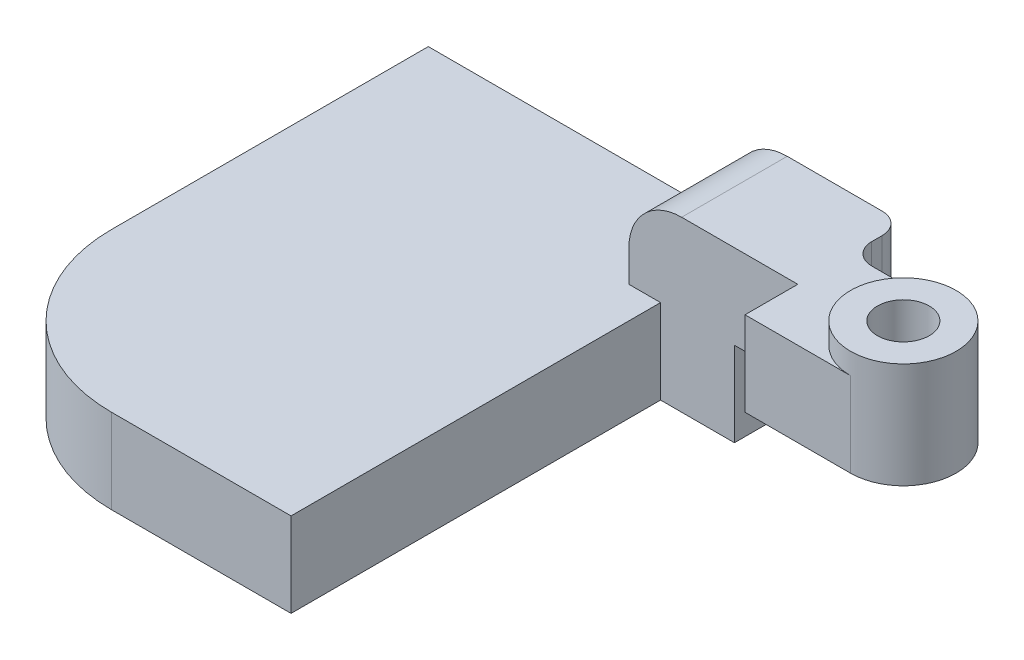
ISO-10303-21;
HEADER;
FILE_DESCRIPTION(('STEP AP214'),'2;1');
FILE_NAME('part.step','',(''),(''),'','','');
FILE_SCHEMA(('AUTOMOTIVE_DESIGN { 1 0 10303 214 1 1 1 1 }'));
ENDSEC;
DATA;
#1=APPLICATION_CONTEXT('core data for automotive mechanical design processes');
#2=APPLICATION_PROTOCOL_DEFINITION('international standard','automotive_design',2000,#1);
#3=PRODUCT_CONTEXT('',#1,'mechanical');
#4=PRODUCT('Part','Part','',(#3));
#5=PRODUCT_RELATED_PRODUCT_CATEGORY('part','',(#4));
#6=PRODUCT_DEFINITION_FORMATION('','',#4);
#7=PRODUCT_DEFINITION_CONTEXT('part definition',#1,'design');
#8=PRODUCT_DEFINITION('design','',#6,#7);
#9=PRODUCT_DEFINITION_SHAPE('','',#8);
#10=(LENGTH_UNIT() NAMED_UNIT(*) SI_UNIT(.MILLI.,.METRE.));
#11=(NAMED_UNIT(*) PLANE_ANGLE_UNIT() SI_UNIT($,.RADIAN.));
#12=(NAMED_UNIT(*) SI_UNIT($,.STERADIAN.) SOLID_ANGLE_UNIT());
#13=UNCERTAINTY_MEASURE_WITH_UNIT(LENGTH_MEASURE(1.E-05),#10,'distance_accuracy_value','');
#14=(GEOMETRIC_REPRESENTATION_CONTEXT(3) GLOBAL_UNCERTAINTY_ASSIGNED_CONTEXT((#13)) GLOBAL_UNIT_ASSIGNED_CONTEXT((#10,
#11,#12)) REPRESENTATION_CONTEXT('',''));
#15=CARTESIAN_POINT('',(0.,0.,0.));
#16=DIRECTION('',(0.,0.,1.));
#17=DIRECTION('',(1.,0.,0.));
#18=AXIS2_PLACEMENT_3D('',#15,#16,#17);
#19=CARTESIAN_POINT('',(0.,0.,0.));
#20=DIRECTION('',(0.,1.,0.));
#21=DIRECTION('',(0.,0.,1.));
#22=AXIS2_PLACEMENT_3D('',#19,#20,#21);
#23=PLANE('',#22);
#24=DIRECTION('',(0.,0.,1.));
#25=VECTOR('',#24,1.);
#26=CARTESIAN_POINT('',(-28.,0.,30.));
#27=LINE('',#26,#25);
#28=CARTESIAN_POINT('',(-28.,0.,-5.));
#29=VERTEX_POINT('',#28);
#30=CARTESIAN_POINT('',(-28.,0.,30.));
#31=VERTEX_POINT('',#30);
#32=EDGE_CURVE('E315',#29,#31,#27,.T.);
#33=ORIENTED_EDGE('',*,*,#32,.F.);
#34=DIRECTION('',(1.,0.,0.));
#35=VECTOR('',#34,1.);
#36=CARTESIAN_POINT('',(-31.,0.,-5.));
#37=LINE('',#36,#35);
#38=CARTESIAN_POINT('',(-31.,0.,-5.));
#39=VERTEX_POINT('',#38);
#40=EDGE_CURVE('E193',#39,#29,#37,.T.);
#41=ORIENTED_EDGE('',*,*,#40,.F.);
#42=DIRECTION('',(0.,0.,1.));
#43=VECTOR('',#42,1.);
#44=CARTESIAN_POINT('',(-31.,0.,-5.));
#45=LINE('',#44,#43);
#46=CARTESIAN_POINT('',(-31.,0.,-15.));
#47=VERTEX_POINT('',#46);
#48=EDGE_CURVE('E179',#47,#39,#45,.T.);
#49=ORIENTED_EDGE('',*,*,#48,.F.);
#50=DIRECTION('',(-1.,0.,0.));
#51=VECTOR('',#50,1.);
#52=CARTESIAN_POINT('',(-25.,0.,-15.));
#53=LINE('',#52,#51);
#54=CARTESIAN_POINT('',(-60.,0.,-15.));
#55=VERTEX_POINT('',#54);
#56=EDGE_CURVE('E191',#47,#55,#53,.T.);
#57=ORIENTED_EDGE('',*,*,#56,.T.);
#58=DIRECTION('',(0.,0.,-1.));
#59=VECTOR('',#58,1.);
#60=CARTESIAN_POINT('',(-60.,0.,30.));
#61=LINE('',#60,#59);
#62=CARTESIAN_POINT('',(-60.,0.,15.));
#63=VERTEX_POINT('',#62);
#64=EDGE_CURVE('E283',#63,#55,#61,.T.);
#65=ORIENTED_EDGE('',*,*,#64,.F.);
#66=CARTESIAN_POINT('',(-45.,0.,15.));
#67=DIRECTION('',(0.,1.,0.));
#68=DIRECTION('',(0.,0.,1.));
#69=AXIS2_PLACEMENT_3D('',#66,#67,#68);
#70=CIRCLE('',#69,15.);
#71=CARTESIAN_POINT('',(-45.,0.,30.));
#72=VERTEX_POINT('',#71);
#73=EDGE_CURVE('E241',#63,#72,#70,.T.);
#74=ORIENTED_EDGE('',*,*,#73,.T.);
#75=DIRECTION('',(1.,0.,0.));
#76=VECTOR('',#75,1.);
#77=CARTESIAN_POINT('',(-25.,0.,30.));
#78=LINE('',#77,#76);
#79=EDGE_CURVE('E201',#72,#31,#78,.T.);
#80=ORIENTED_EDGE('',*,*,#79,.T.);
#81=EDGE_LOOP('',(#33,#41,#49,#57,#65,#74,#80));
#82=FACE_BOUND('',#81,.T.);
#83=ADVANCED_FACE('F45',(#82),#23,.T.);
#84=CARTESIAN_POINT('',(-70.,0.,30.));
#85=DIRECTION('',(0.,0.,-1.));
#86=DIRECTION('',(-1.,0.,0.));
#87=AXIS2_PLACEMENT_3D('',#84,#85,#86);
#88=PLANE('',#87);
#89=ORIENTED_EDGE('',*,*,#79,.F.);
#90=DIRECTION('',(0.,1.,0.));
#91=VECTOR('',#90,1.);
#92=CARTESIAN_POINT('',(-45.,0.,30.));
#93=LINE('',#92,#91);
#94=CARTESIAN_POINT('',(-45.,-8.,30.));
#95=VERTEX_POINT('',#94);
#96=EDGE_CURVE('E244',#72,#95,#93,.F.);
#97=ORIENTED_EDGE('',*,*,#96,.T.);
#98=DIRECTION('',(-1.,0.,0.));
#99=VECTOR('',#98,1.);
#100=CARTESIAN_POINT('',(-70.,-8.,30.));
#101=LINE('',#100,#99);
#102=CARTESIAN_POINT('',(-28.,-8.,30.));
#103=VERTEX_POINT('',#102);
#104=EDGE_CURVE('E333',#103,#95,#101,.T.);
#105=ORIENTED_EDGE('',*,*,#104,.F.);
#106=DIRECTION('',(0.,-1.,0.));
#107=VECTOR('',#106,1.);
#108=CARTESIAN_POINT('',(-28.,0.,30.));
#109=LINE('',#108,#107);
#110=EDGE_CURVE('E258',#31,#103,#109,.T.);
#111=ORIENTED_EDGE('',*,*,#110,.F.);
#112=EDGE_LOOP('',(#89,#97,#105,#111));
#113=FACE_BOUND('',#112,.T.);
#114=ADVANCED_FACE('F403',(#113),#88,.F.);
#115=CARTESIAN_POINT('',(-70.,0.,-15.));
#116=DIRECTION('',(0.,0.,-1.));
#117=DIRECTION('',(-1.,0.,0.));
#118=AXIS2_PLACEMENT_3D('',#115,#116,#117);
#119=PLANE('',#118);
#120=DIRECTION('',(0.,-1.,0.));
#121=VECTOR('',#120,1.);
#122=CARTESIAN_POINT('',(-31.,8.,-15.));
#123=LINE('',#122,#121);
#124=CARTESIAN_POINT('',(-31.,3.,-15.));
#125=VERTEX_POINT('',#124);
#126=EDGE_CURVE('E175',#125,#47,#123,.T.);
#127=ORIENTED_EDGE('',*,*,#126,.F.);
#128=CARTESIAN_POINT('',(-26.,3.,-15.));
#129=DIRECTION('',(0.,0.,-1.));
#130=DIRECTION('',(-1.,0.,0.));
#131=AXIS2_PLACEMENT_3D('',#128,#129,#130);
#132=CIRCLE('',#131,5.);
#133=CARTESIAN_POINT('',(-26.,8.,-15.));
#134=VERTEX_POINT('',#133);
#135=EDGE_CURVE('E68',#125,#134,#132,.T.);
#136=ORIENTED_EDGE('',*,*,#135,.T.);
#137=DIRECTION('',(-1.,0.,0.));
#138=VECTOR('',#137,1.);
#139=CARTESIAN_POINT('',(-70.,8.,-15.));
#140=LINE('',#139,#138);
#141=CARTESIAN_POINT('',(-17.,8.,-15.));
#142=VERTEX_POINT('',#141);
#143=EDGE_CURVE('E312',#142,#134,#140,.T.);
#144=ORIENTED_EDGE('',*,*,#143,.F.);
#145=DIRECTION('',(0.,-1.,0.));
#146=VECTOR('',#145,1.);
#147=CARTESIAN_POINT('',(-17.,0.,-15.));
#148=LINE('',#147,#146);
#149=CARTESIAN_POINT('',(-17.,0.,-15.));
#150=VERTEX_POINT('',#149);
#151=EDGE_CURVE('E206',#142,#150,#148,.T.);
#152=ORIENTED_EDGE('',*,*,#151,.T.);
#153=DIRECTION('',(1.,0.,0.));
#154=VECTOR('',#153,1.);
#155=CARTESIAN_POINT('',(-21.,0.,-15.));
#156=LINE('',#155,#154);
#157=CARTESIAN_POINT('',(-21.,0.,-15.));
#158=VERTEX_POINT('',#157);
#159=EDGE_CURVE('E447',#158,#150,#156,.T.);
#160=ORIENTED_EDGE('',*,*,#159,.F.);
#161=DIRECTION('',(0.,-1.,0.));
#162=VECTOR('',#161,1.);
#163=CARTESIAN_POINT('',(-21.,-3.,-15.));
#164=LINE('',#163,#162);
#165=CARTESIAN_POINT('',(-21.,-8.,-15.));
#166=VERTEX_POINT('',#165);
#167=EDGE_CURVE('E307',#158,#166,#164,.T.);
#168=ORIENTED_EDGE('',*,*,#167,.T.);
#169=DIRECTION('',(1.,0.,0.));
#170=VECTOR('',#169,1.);
#171=CARTESIAN_POINT('',(-70.,-8.,-15.));
#172=LINE('',#171,#170);
#173=CARTESIAN_POINT('',(-60.,-8.,-15.));
#174=VERTEX_POINT('',#173);
#175=EDGE_CURVE('E329',#174,#166,#172,.T.);
#176=ORIENTED_EDGE('',*,*,#175,.F.);
#177=DIRECTION('',(0.,-1.,0.));
#178=VECTOR('',#177,1.);
#179=CARTESIAN_POINT('',(-60.,0.,-15.));
#180=LINE('',#179,#178);
#181=EDGE_CURVE('E199',#55,#174,#180,.T.);
#182=ORIENTED_EDGE('',*,*,#181,.F.);
#183=ORIENTED_EDGE('',*,*,#56,.F.);
#184=EDGE_LOOP('',(#127,#136,#144,#152,#160,#168,#176,#182,#183));
#185=FACE_BOUND('',#184,.T.);
#186=ADVANCED_FACE('F197',(#185),#119,.T.);
#187=CARTESIAN_POINT('',(-25.,-2.,-5.));
#188=DIRECTION('',(0.,0.,1.));
#189=DIRECTION('',(1.,0.,0.));
#190=AXIS2_PLACEMENT_3D('',#187,#188,#189);
#191=PLANE('',#190);
#192=DIRECTION('',(1.,0.,0.));
#193=VECTOR('',#192,1.);
#194=CARTESIAN_POINT('',(-25.,8.,-5.));
#195=LINE('',#194,#193);
#196=CARTESIAN_POINT('',(-26.,8.,-5.));
#197=VERTEX_POINT('',#196);
#198=CARTESIAN_POINT('',(-15.,8.,-5.));
#199=VERTEX_POINT('',#198);
#200=EDGE_CURVE('E301',#197,#199,#195,.T.);
#201=ORIENTED_EDGE('',*,*,#200,.F.);
#202=CARTESIAN_POINT('',(-26.,3.,-5.));
#203=DIRECTION('',(0.,0.,1.));
#204=DIRECTION('',(1.,0.,0.));
#205=AXIS2_PLACEMENT_3D('',#202,#203,#204);
#206=CIRCLE('',#205,5.);
#207=CARTESIAN_POINT('',(-31.,3.,-5.));
#208=VERTEX_POINT('',#207);
#209=EDGE_CURVE('E11',#197,#208,#206,.T.);
#210=ORIENTED_EDGE('',*,*,#209,.T.);
#211=DIRECTION('',(0.,1.,0.));
#212=VECTOR('',#211,1.);
#213=CARTESIAN_POINT('',(-31.,8.,-5.));
#214=LINE('',#213,#212);
#215=EDGE_CURVE('E185',#39,#208,#214,.T.);
#216=ORIENTED_EDGE('',*,*,#215,.F.);
#217=ORIENTED_EDGE('',*,*,#40,.T.);
#218=DIRECTION('',(0.,1.,0.));
#219=VECTOR('',#218,1.);
#220=CARTESIAN_POINT('',(-28.,0.,-5.));
#221=LINE('',#220,#219);
#222=CARTESIAN_POINT('',(-28.,-8.,-5.));
#223=VERTEX_POINT('',#222);
#224=EDGE_CURVE('E257',#223,#29,#221,.T.);
#225=ORIENTED_EDGE('',*,*,#224,.F.);
#226=DIRECTION('',(1.,0.,0.));
#227=VECTOR('',#226,1.);
#228=CARTESIAN_POINT('',(-25.,-8.,-5.));
#229=LINE('',#228,#227);
#230=CARTESIAN_POINT('',(-21.,-8.,-5.));
#231=VERTEX_POINT('',#230);
#232=EDGE_CURVE('E337',#223,#231,#229,.T.);
#233=ORIENTED_EDGE('',*,*,#232,.T.);
#234=DIRECTION('',(0.,-1.,0.));
#235=VECTOR('',#234,1.);
#236=CARTESIAN_POINT('',(-21.,-3.,-5.));
#237=LINE('',#236,#235);
#238=CARTESIAN_POINT('',(-21.,0.,-4.99999999999998));
#239=VERTEX_POINT('',#238);
#240=EDGE_CURVE('E464',#239,#231,#237,.T.);
#241=ORIENTED_EDGE('',*,*,#240,.F.);
#242=DIRECTION('',(-1.,0.,0.));
#243=VECTOR('',#242,1.);
#244=CARTESIAN_POINT('',(-25.,0.,-5.));
#245=LINE('',#244,#243);
#246=CARTESIAN_POINT('',(-15.,0.,-4.99999999999998));
#247=VERTEX_POINT('',#246);
#248=EDGE_CURVE('E276',#247,#239,#245,.T.);
#249=ORIENTED_EDGE('',*,*,#248,.F.);
#250=DIRECTION('',(0.,1.,0.));
#251=VECTOR('',#250,1.);
#252=CARTESIAN_POINT('',(-15.,-2.,-5.));
#253=LINE('',#252,#251);
#254=EDGE_CURVE('E270',#247,#199,#253,.T.);
#255=ORIENTED_EDGE('',*,*,#254,.T.);
#256=EDGE_LOOP('',(#201,#210,#216,#217,#225,#233,#241,#249,#255));
#257=FACE_BOUND('',#256,.T.);
#258=ADVANCED_FACE('F410',(#257),#191,.T.);
#259=CARTESIAN_POINT('',(-15.,0.,13.8679622641132));
#260=DIRECTION('',(1.,0.,0.));
#261=DIRECTION('',(0.,0.,-1.));
#262=AXIS2_PLACEMENT_3D('',#259,#260,#261);
#263=PLANE('',#262);
#264=DIRECTION('',(0.,0.,-1.));
#265=VECTOR('',#264,1.);
#266=CARTESIAN_POINT('',(-15.,0.,30.));
#267=LINE('',#266,#265);
#268=CARTESIAN_POINT('',(-15.,0.,-12.));
#269=VERTEX_POINT('',#268);
#270=CARTESIAN_POINT('',(-15.,0.,-13.));
#271=VERTEX_POINT('',#270);
#272=EDGE_CURVE('E456',#269,#271,#267,.T.);
#273=ORIENTED_EDGE('',*,*,#272,.T.);
#274=DIRECTION('',(0.,-1.,0.));
#275=VECTOR('',#274,1.);
#276=CARTESIAN_POINT('',(-15.,0.,-13.));
#277=LINE('',#276,#275);
#278=CARTESIAN_POINT('',(-15.,8.,-13.));
#279=VERTEX_POINT('',#278);
#280=EDGE_CURVE('E221',#271,#279,#277,.F.);
#281=ORIENTED_EDGE('',*,*,#280,.T.);
#282=DIRECTION('',(0.,0.,-1.));
#283=VECTOR('',#282,1.);
#284=CARTESIAN_POINT('',(-15.,8.,-9.99999999999999));
#285=LINE('',#284,#283);
#286=CARTESIAN_POINT('',(-15.,8.,-12.));
#287=VERTEX_POINT('',#286);
#288=EDGE_CURVE('E363',#287,#279,#285,.T.);
#289=ORIENTED_EDGE('',*,*,#288,.F.);
#290=DIRECTION('',(0.,1.,0.));
#291=VECTOR('',#290,1.);
#292=CARTESIAN_POINT('',(-15.,0.,-12.));
#293=LINE('',#292,#291);
#294=EDGE_CURVE('E217',#287,#269,#293,.F.);
#295=ORIENTED_EDGE('',*,*,#294,.T.);
#296=EDGE_LOOP('',(#273,#281,#289,#295));
#297=FACE_BOUND('',#296,.T.);
#298=ADVANCED_FACE('F501',(#297),#263,.T.);
#299=CARTESIAN_POINT('',(0.,0.,0.));
#300=DIRECTION('',(0.,1.,0.));
#301=DIRECTION('',(0.,0.,1.));
#302=AXIS2_PLACEMENT_3D('',#299,#300,#301);
#303=PLANE('',#302);
#304=CARTESIAN_POINT('',(-5.,0.,-5.));
#305=DIRECTION('',(0.,-1.,0.));
#306=DIRECTION('',(0.,0.,-1.));
#307=AXIS2_PLACEMENT_3D('',#304,#305,#306);
#308=CIRCLE('',#307,2.25000000000001);
#309=CARTESIAN_POINT('',(-5.,0.,-7.25000000000001));
#310=VERTEX_POINT('',#309);
#311=EDGE_CURVE('E202',#310,#310,#308,.T.);
#312=ORIENTED_EDGE('',*,*,#311,.F.);
#313=EDGE_LOOP('',(#312));
#314=FACE_BOUND('',#313,.T.);
#315=DIRECTION('',(0.,0.,-1.));
#316=VECTOR('',#315,1.);
#317=CARTESIAN_POINT('',(-15.,0.,0.));
#318=LINE('',#317,#316);
#319=CARTESIAN_POINT('',(-15.,0.,0.));
#320=VERTEX_POINT('',#319);
#321=EDGE_CURVE('E298',#320,#247,#318,.T.);
#322=ORIENTED_EDGE('',*,*,#321,.T.);
#323=ORIENTED_EDGE('',*,*,#248,.T.);
#324=DIRECTION('',(0.,0.,-1.));
#325=VECTOR('',#324,1.);
#326=CARTESIAN_POINT('',(-21.,0.,30.));
#327=LINE('',#326,#325);
#328=EDGE_CURVE('E450',#239,#158,#327,.T.);
#329=ORIENTED_EDGE('',*,*,#328,.T.);
#330=ORIENTED_EDGE('',*,*,#159,.T.);
#331=CARTESIAN_POINT('',(-17.,0.,-13.));
#332=DIRECTION('',(0.,1.,0.));
#333=DIRECTION('',(0.,0.,1.));
#334=AXIS2_PLACEMENT_3D('',#331,#332,#333);
#335=CIRCLE('',#334,2.);
#336=EDGE_CURVE('E280',#150,#271,#335,.F.);
#337=ORIENTED_EDGE('',*,*,#336,.T.);
#338=ORIENTED_EDGE('',*,*,#272,.F.);
#339=CARTESIAN_POINT('',(-13.,0.,-12.));
#340=DIRECTION('',(0.,1.,0.));
#341=DIRECTION('',(0.,0.,1.));
#342=AXIS2_PLACEMENT_3D('',#339,#340,#341);
#343=CIRCLE('',#342,2.);
#344=CARTESIAN_POINT('',(-13.,0.,-10.));
#345=VERTEX_POINT('',#344);
#346=EDGE_CURVE('E234',#269,#345,#343,.T.);
#347=ORIENTED_EDGE('',*,*,#346,.T.);
#348=DIRECTION('',(-1.,0.,0.));
#349=VECTOR('',#348,1.);
#350=CARTESIAN_POINT('',(0.,0.,-10.));
#351=LINE('',#350,#349);
#352=CARTESIAN_POINT('',(-5.,0.,-10.));
#353=VERTEX_POINT('',#352);
#354=EDGE_CURVE('E349',#353,#345,#351,.T.);
#355=ORIENTED_EDGE('',*,*,#354,.F.);
#356=CARTESIAN_POINT('',(-5.,0.,-5.));
#357=DIRECTION('',(0.,1.,0.));
#358=DIRECTION('',(0.,0.,1.));
#359=AXIS2_PLACEMENT_3D('',#356,#357,#358);
#360=CIRCLE('',#359,5.);
#361=CARTESIAN_POINT('',(0.,0.,-5.));
#362=VERTEX_POINT('',#361);
#363=EDGE_CURVE('E341',#353,#362,#360,.F.);
#364=ORIENTED_EDGE('',*,*,#363,.T.);
#365=CARTESIAN_POINT('',(-5.,0.,-5.));
#366=DIRECTION('',(0.,1.,0.));
#367=DIRECTION('',(0.,0.,1.));
#368=AXIS2_PLACEMENT_3D('',#365,#366,#367);
#369=CIRCLE('',#368,5.);
#370=CARTESIAN_POINT('',(-5.,0.,0.));
#371=VERTEX_POINT('',#370);
#372=EDGE_CURVE('E302',#362,#371,#369,.F.);
#373=ORIENTED_EDGE('',*,*,#372,.T.);
#374=DIRECTION('',(1.,0.,0.));
#375=VECTOR('',#374,1.);
#376=CARTESIAN_POINT('',(-25.,0.,0.));
#377=LINE('',#376,#375);
#378=EDGE_CURVE('E309',#320,#371,#377,.T.);
#379=ORIENTED_EDGE('',*,*,#378,.F.);
#380=EDGE_LOOP('',(#322,#323,#329,#330,#337,#338,#347,#355,#364,#373,#379));
#381=FACE_BOUND('',#380,.T.);
#382=ADVANCED_FACE('F472',(#314,#381),#303,.F.);
#383=CARTESIAN_POINT('',(0.,8.,0.));
#384=DIRECTION('',(0.,1.,0.));
#385=DIRECTION('',(0.,0.,1.));
#386=AXIS2_PLACEMENT_3D('',#383,#384,#385);
#387=PLANE('',#386);
#388=ORIENTED_EDGE('',*,*,#143,.T.);
#389=DIRECTION('',(0.,0.,-1.));
#390=VECTOR('',#389,1.);
#391=CARTESIAN_POINT('',(-26.,8.,-5.));
#392=LINE('',#391,#390);
#393=EDGE_CURVE('E54',#134,#197,#392,.F.);
#394=ORIENTED_EDGE('',*,*,#393,.T.);
#395=ORIENTED_EDGE('',*,*,#200,.T.);
#396=DIRECTION('',(0.,0.,-1.));
#397=VECTOR('',#396,1.);
#398=CARTESIAN_POINT('',(-15.,8.,0.));
#399=LINE('',#398,#397);
#400=CARTESIAN_POINT('',(-15.,8.,0.));
#401=VERTEX_POINT('',#400);
#402=EDGE_CURVE('E269',#401,#199,#399,.T.);
#403=ORIENTED_EDGE('',*,*,#402,.F.);
#404=DIRECTION('',(1.,0.,0.));
#405=VECTOR('',#404,1.);
#406=CARTESIAN_POINT('',(-25.,8.,0.));
#407=LINE('',#406,#405);
#408=CARTESIAN_POINT('',(-5.,8.,0.));
#409=VERTEX_POINT('',#408);
#410=EDGE_CURVE('E364',#401,#409,#407,.T.);
#411=ORIENTED_EDGE('',*,*,#410,.T.);
#412=CARTESIAN_POINT('',(-5.,8.,-5.));
#413=DIRECTION('',(0.,1.,0.));
#414=DIRECTION('',(0.,0.,1.));
#415=AXIS2_PLACEMENT_3D('',#412,#413,#414);
#416=CIRCLE('',#415,5.);
#417=CARTESIAN_POINT('',(-5.,8.,-10.));
#418=VERTEX_POINT('',#417);
#419=EDGE_CURVE('E292',#418,#409,#416,.T.);
#420=ORIENTED_EDGE('',*,*,#419,.F.);
#421=DIRECTION('',(-1.,0.,0.));
#422=VECTOR('',#421,1.);
#423=CARTESIAN_POINT('',(0.,8.,-10.));
#424=LINE('',#423,#422);
#425=CARTESIAN_POINT('',(-13.,8.,-10.));
#426=VERTEX_POINT('',#425);
#427=EDGE_CURVE('E359',#418,#426,#424,.T.);
#428=ORIENTED_EDGE('',*,*,#427,.T.);
#429=CARTESIAN_POINT('',(-13.,8.,-12.));
#430=DIRECTION('',(0.,1.,0.));
#431=DIRECTION('',(0.,0.,1.));
#432=AXIS2_PLACEMENT_3D('',#429,#430,#431);
#433=CIRCLE('',#432,2.);
#434=EDGE_CURVE('E231',#426,#287,#433,.F.);
#435=ORIENTED_EDGE('',*,*,#434,.T.);
#436=ORIENTED_EDGE('',*,*,#288,.T.);
#437=CARTESIAN_POINT('',(-17.,8.,-13.));
#438=DIRECTION('',(0.,1.,0.));
#439=DIRECTION('',(0.,0.,1.));
#440=AXIS2_PLACEMENT_3D('',#437,#438,#439);
#441=CIRCLE('',#440,2.);
#442=EDGE_CURVE('E224',#279,#142,#441,.T.);
#443=ORIENTED_EDGE('',*,*,#442,.T.);
#444=EDGE_LOOP('',(#388,#394,#395,#403,#411,#420,#428,#435,#436,#443));
#445=FACE_BOUND('',#444,.T.);
#446=ADVANCED_FACE('F481',(#445),#387,.T.);
#447=CARTESIAN_POINT('',(-25.,8.,0.));
#448=DIRECTION('',(0.,0.,-1.));
#449=DIRECTION('',(-1.,0.,0.));
#450=AXIS2_PLACEMENT_3D('',#447,#448,#449);
#451=PLANE('',#450);
#452=ORIENTED_EDGE('',*,*,#410,.F.);
#453=DIRECTION('',(0.,1.,0.));
#454=VECTOR('',#453,1.);
#455=CARTESIAN_POINT('',(-15.,-2.,0.));
#456=LINE('',#455,#454);
#457=EDGE_CURVE('E267',#320,#401,#456,.T.);
#458=ORIENTED_EDGE('',*,*,#457,.F.);
#459=ORIENTED_EDGE('',*,*,#378,.T.);
#460=DIRECTION('',(0.,-1.,0.));
#461=VECTOR('',#460,1.);
#462=CARTESIAN_POINT('',(-5.,8.,0.));
#463=LINE('',#462,#461);
#464=EDGE_CURVE('E311',#371,#409,#463,.F.);
#465=ORIENTED_EDGE('',*,*,#464,.T.);
#466=EDGE_LOOP('',(#452,#458,#459,#465));
#467=FACE_BOUND('',#466,.T.);
#468=ADVANCED_FACE('F483',(#467),#451,.F.);
#469=CARTESIAN_POINT('',(0.,8.,-10.));
#470=DIRECTION('',(0.,0.,1.));
#471=DIRECTION('',(1.,0.,0.));
#472=AXIS2_PLACEMENT_3D('',#469,#470,#471);
#473=PLANE('',#472);
#474=ORIENTED_EDGE('',*,*,#354,.T.);
#475=DIRECTION('',(0.,1.,0.));
#476=VECTOR('',#475,1.);
#477=CARTESIAN_POINT('',(-13.,8.,-10.));
#478=LINE('',#477,#476);
#479=EDGE_CURVE('E227',#345,#426,#478,.T.);
#480=ORIENTED_EDGE('',*,*,#479,.T.);
#481=ORIENTED_EDGE('',*,*,#427,.F.);
#482=DIRECTION('',(0.,-1.,0.));
#483=VECTOR('',#482,1.);
#484=CARTESIAN_POINT('',(-5.,8.,-10.));
#485=LINE('',#484,#483);
#486=EDGE_CURVE('E296',#418,#353,#485,.T.);
#487=ORIENTED_EDGE('',*,*,#486,.T.);
#488=EDGE_LOOP('',(#474,#480,#481,#487));
#489=FACE_BOUND('',#488,.T.);
#490=ADVANCED_FACE('F493',(#489),#473,.F.);
#491=CARTESIAN_POINT('',(-5.,8.,-5.));
#492=DIRECTION('',(0.,-1.,0.));
#493=DIRECTION('',(0.,0.,-1.));
#494=AXIS2_PLACEMENT_3D('',#491,#492,#493);
#495=CYLINDRICAL_SURFACE('',#494,5.);
#496=ORIENTED_EDGE('',*,*,#486,.F.);
#497=ORIENTED_EDGE('',*,*,#419,.T.);
#498=ORIENTED_EDGE('',*,*,#464,.F.);
#499=ORIENTED_EDGE('',*,*,#372,.F.);
#500=DIRECTION('',(0.,-1.,0.));
#501=VECTOR('',#500,1.);
#502=CARTESIAN_POINT('',(0.,8.,-5.));
#503=LINE('',#502,#501);
#504=CARTESIAN_POINT('',(0.,8.,-5.));
#505=VERTEX_POINT('',#504);
#506=EDGE_CURVE('E295',#362,#505,#503,.F.);
#507=ORIENTED_EDGE('',*,*,#506,.T.);
#508=ORIENTED_EDGE('',*,*,#506,.F.);
#509=ORIENTED_EDGE('',*,*,#363,.F.);
#510=EDGE_LOOP('',(#496,#497,#498,#499,#507,#508,#509));
#511=FACE_BOUND('',#510,.T.);
#512=CARTESIAN_POINT('',(-5.,10.,-5.));
#513=DIRECTION('',(0.,1.,0.));
#514=DIRECTION('',(0.,0.,1.));
#515=AXIS2_PLACEMENT_3D('',#512,#513,#514);
#516=CIRCLE('',#515,5.);
#517=CARTESIAN_POINT('',(-5.,10.,0.));
#518=VERTEX_POINT('',#517);
#519=EDGE_CURVE('E274',#518,#518,#516,.T.);
#520=ORIENTED_EDGE('',*,*,#519,.F.);
#521=EDGE_LOOP('',(#520));
#522=FACE_BOUND('',#521,.T.);
#523=ADVANCED_FACE('F488',(#511,#522),#495,.T.);
#524=CARTESIAN_POINT('',(-15.,-2.,0.));
#525=DIRECTION('',(1.,0.,0.));
#526=DIRECTION('',(0.,0.,-1.));
#527=AXIS2_PLACEMENT_3D('',#524,#525,#526);
#528=PLANE('',#527);
#529=ORIENTED_EDGE('',*,*,#457,.T.);
#530=ORIENTED_EDGE('',*,*,#402,.T.);
#531=ORIENTED_EDGE('',*,*,#254,.F.);
#532=ORIENTED_EDGE('',*,*,#321,.F.);
#533=EDGE_LOOP('',(#529,#530,#531,#532));
#534=FACE_BOUND('',#533,.T.);
#535=ADVANCED_FACE('F477',(#534),#528,.F.);
#536=CARTESIAN_POINT('',(-5.,10.,-5.));
#537=DIRECTION('',(0.,1.,0.));
#538=DIRECTION('',(0.,0.,1.));
#539=AXIS2_PLACEMENT_3D('',#536,#537,#538);
#540=PLANE('',#539);
#541=CARTESIAN_POINT('',(-5.,10.,-5.));
#542=DIRECTION('',(0.,1.,0.));
#543=DIRECTION('',(0.,0.,1.));
#544=AXIS2_PLACEMENT_3D('',#541,#542,#543);
#545=CIRCLE('',#544,2.45000000000001);
#546=CARTESIAN_POINT('',(-5.,10.,-2.54999999999999));
#547=VERTEX_POINT('',#546);
#548=EDGE_CURVE('E264',#547,#547,#545,.T.);
#549=ORIENTED_EDGE('',*,*,#548,.F.);
#550=EDGE_LOOP('',(#549));
#551=FACE_BOUND('',#550,.T.);
#552=ORIENTED_EDGE('',*,*,#519,.T.);
#553=EDGE_LOOP('',(#552));
#554=FACE_BOUND('',#553,.T.);
#555=ADVANCED_FACE('F529',(#551,#554),#540,.T.);
#556=CARTESIAN_POINT('',(-5.,6.,-5.));
#557=DIRECTION('',(0.,-1.,0.));
#558=DIRECTION('',(0.,0.,-1.));
#559=AXIS2_PLACEMENT_3D('',#556,#557,#558);
#560=PLANE('',#559);
#561=CARTESIAN_POINT('',(-5.,6.,-5.));
#562=DIRECTION('',(0.,-1.,0.));
#563=DIRECTION('',(0.,0.,-1.));
#564=AXIS2_PLACEMENT_3D('',#561,#562,#563);
#565=CIRCLE('',#564,1.50000000000001);
#566=CARTESIAN_POINT('',(-5.,6.,-6.50000000000001));
#567=VERTEX_POINT('',#566);
#568=EDGE_CURVE('E265',#567,#567,#565,.T.);
#569=ORIENTED_EDGE('',*,*,#568,.T.);
#570=EDGE_LOOP('',(#569));
#571=FACE_BOUND('',#570,.T.);
#572=CARTESIAN_POINT('',(-5.,6.,-5.));
#573=DIRECTION('',(0.,1.,0.));
#574=DIRECTION('',(0.,0.,1.));
#575=AXIS2_PLACEMENT_3D('',#572,#573,#574);
#576=CIRCLE('',#575,2.45000000000001);
#577=CARTESIAN_POINT('',(-5.,6.,-2.54999999999999));
#578=VERTEX_POINT('',#577);
#579=EDGE_CURVE('E261',#578,#578,#576,.T.);
#580=ORIENTED_EDGE('',*,*,#579,.T.);
#581=EDGE_LOOP('',(#580));
#582=FACE_BOUND('',#581,.T.);
#583=ADVANCED_FACE('F385',(#571,#582),#560,.F.);
#584=CARTESIAN_POINT('',(-5.,10.,-5.));
#585=DIRECTION('',(0.,1.,0.));
#586=DIRECTION('',(0.,0.,1.));
#587=AXIS2_PLACEMENT_3D('',#584,#585,#586);
#588=CYLINDRICAL_SURFACE('',#587,2.45000000000001);
#589=ORIENTED_EDGE('',*,*,#579,.F.);
#590=EDGE_LOOP('',(#589));
#591=FACE_BOUND('',#590,.T.);
#592=ORIENTED_EDGE('',*,*,#548,.T.);
#593=EDGE_LOOP('',(#592));
#594=FACE_BOUND('',#593,.T.);
#595=ADVANCED_FACE('F391',(#591,#594),#588,.F.);
#596=CARTESIAN_POINT('',(-5.,0.,-5.));
#597=DIRECTION('',(0.,-1.,0.));
#598=DIRECTION('',(0.,0.,-1.));
#599=AXIS2_PLACEMENT_3D('',#596,#597,#598);
#600=CYLINDRICAL_SURFACE('',#599,1.50000000000001);
#601=CARTESIAN_POINT('',(-5.,2.,-5.));
#602=DIRECTION('',(0.,1.,0.));
#603=DIRECTION('',(0.,0.,1.));
#604=AXIS2_PLACEMENT_3D('',#601,#602,#603);
#605=CIRCLE('',#604,1.50000000000001);
#606=CARTESIAN_POINT('',(-5.,2.,-3.49999999999999));
#607=VERTEX_POINT('',#606);
#608=EDGE_CURVE('E288',#607,#607,#605,.F.);
#609=ORIENTED_EDGE('',*,*,#608,.T.);
#610=EDGE_LOOP('',(#609));
#611=FACE_BOUND('',#610,.T.);
#612=ORIENTED_EDGE('',*,*,#568,.F.);
#613=EDGE_LOOP('',(#612));
#614=FACE_BOUND('',#613,.T.);
#615=ADVANCED_FACE('F388',(#611,#614),#600,.F.);
#616=CARTESIAN_POINT('',(-5.,2.,-5.));
#617=DIRECTION('',(0.,1.,0.));
#618=DIRECTION('',(0.,0.,1.));
#619=AXIS2_PLACEMENT_3D('',#616,#617,#618);
#620=PLANE('',#619);
#621=CARTESIAN_POINT('',(-5.,2.,-5.));
#622=DIRECTION('',(0.,-1.,0.));
#623=DIRECTION('',(0.,0.,-1.));
#624=AXIS2_PLACEMENT_3D('',#621,#622,#623);
#625=CIRCLE('',#624,2.25000000000001);
#626=CARTESIAN_POINT('',(-5.,2.,-7.25000000000001));
#627=VERTEX_POINT('',#626);
#628=EDGE_CURVE('E210',#627,#627,#625,.T.);
#629=ORIENTED_EDGE('',*,*,#628,.T.);
#630=EDGE_LOOP('',(#629));
#631=FACE_BOUND('',#630,.T.);
#632=ORIENTED_EDGE('',*,*,#608,.F.);
#633=EDGE_LOOP('',(#632));
#634=FACE_BOUND('',#633,.T.);
#635=ADVANCED_FACE('F390',(#631,#634),#620,.F.);
#636=CARTESIAN_POINT('',(-5.,0.,-5.));
#637=DIRECTION('',(0.,-1.,0.));
#638=DIRECTION('',(0.,0.,-1.));
#639=AXIS2_PLACEMENT_3D('',#636,#637,#638);
#640=CYLINDRICAL_SURFACE('',#639,2.25000000000001);
#641=ORIENTED_EDGE('',*,*,#628,.F.);
#642=EDGE_LOOP('',(#641));
#643=FACE_BOUND('',#642,.T.);
#644=ORIENTED_EDGE('',*,*,#311,.T.);
#645=EDGE_LOOP('',(#644));
#646=FACE_BOUND('',#645,.T.);
#647=ADVANCED_FACE('F397',(#643,#646),#640,.F.);
#648=CARTESIAN_POINT('',(0.,-8.,0.));
#649=DIRECTION('',(0.,-1.,0.));
#650=DIRECTION('',(0.,0.,-1.));
#651=AXIS2_PLACEMENT_3D('',#648,#649,#650);
#652=PLANE('',#651);
#653=DIRECTION('',(0.,0.,-1.));
#654=VECTOR('',#653,1.);
#655=CARTESIAN_POINT('',(-21.,-8.,-5.));
#656=LINE('',#655,#654);
#657=EDGE_CURVE('E279',#231,#166,#656,.T.);
#658=ORIENTED_EDGE('',*,*,#657,.F.);
#659=ORIENTED_EDGE('',*,*,#232,.F.);
#660=DIRECTION('',(0.,0.,-1.));
#661=VECTOR('',#660,1.);
#662=CARTESIAN_POINT('',(-28.,-8.,30.));
#663=LINE('',#662,#661);
#664=EDGE_CURVE('E255',#103,#223,#663,.T.);
#665=ORIENTED_EDGE('',*,*,#664,.F.);
#666=ORIENTED_EDGE('',*,*,#104,.T.);
#667=CARTESIAN_POINT('',(-45.,-8.,15.));
#668=DIRECTION('',(0.,-1.,0.));
#669=DIRECTION('',(0.,0.,-1.));
#670=AXIS2_PLACEMENT_3D('',#667,#668,#669);
#671=CIRCLE('',#670,15.);
#672=CARTESIAN_POINT('',(-60.,-8.,15.));
#673=VERTEX_POINT('',#672);
#674=EDGE_CURVE('E247',#95,#673,#671,.T.);
#675=ORIENTED_EDGE('',*,*,#674,.T.);
#676=DIRECTION('',(0.,0.,1.));
#677=VECTOR('',#676,1.);
#678=CARTESIAN_POINT('',(-60.,-8.,30.));
#679=LINE('',#678,#677);
#680=EDGE_CURVE('E282',#174,#673,#679,.T.);
#681=ORIENTED_EDGE('',*,*,#680,.F.);
#682=ORIENTED_EDGE('',*,*,#175,.T.);
#683=EDGE_LOOP('',(#658,#659,#665,#666,#675,#681,#682));
#684=FACE_BOUND('',#683,.T.);
#685=ADVANCED_FACE('F441',(#684),#652,.T.);
#686=CARTESIAN_POINT('',(-28.,0.,0.));
#687=DIRECTION('',(1.,0.,0.));
#688=DIRECTION('',(0.,0.,-1.));
#689=AXIS2_PLACEMENT_3D('',#686,#687,#688);
#690=PLANE('',#689);
#691=ORIENTED_EDGE('',*,*,#110,.T.);
#692=ORIENTED_EDGE('',*,*,#664,.T.);
#693=ORIENTED_EDGE('',*,*,#224,.T.);
#694=ORIENTED_EDGE('',*,*,#32,.T.);
#695=EDGE_LOOP('',(#691,#692,#693,#694));
#696=FACE_BOUND('',#695,.T.);
#697=ADVANCED_FACE('F419',(#696),#690,.T.);
#698=CARTESIAN_POINT('',(-17.,0.,-13.));
#699=DIRECTION('',(0.,-1.,0.));
#700=DIRECTION('',(0.,0.,-1.));
#701=AXIS2_PLACEMENT_3D('',#698,#699,#700);
#702=CYLINDRICAL_SURFACE('',#701,2.);
#703=ORIENTED_EDGE('',*,*,#336,.F.);
#704=ORIENTED_EDGE('',*,*,#151,.F.);
#705=ORIENTED_EDGE('',*,*,#442,.F.);
#706=ORIENTED_EDGE('',*,*,#280,.F.);
#707=EDGE_LOOP('',(#703,#704,#705,#706));
#708=FACE_BOUND('',#707,.T.);
#709=ADVANCED_FACE('F415',(#708),#702,.T.);
#710=CARTESIAN_POINT('',(-13.,8.,-12.));
#711=DIRECTION('',(0.,1.,0.));
#712=DIRECTION('',(0.,0.,1.));
#713=AXIS2_PLACEMENT_3D('',#710,#711,#712);
#714=CYLINDRICAL_SURFACE('',#713,2.);
#715=ORIENTED_EDGE('',*,*,#346,.F.);
#716=ORIENTED_EDGE('',*,*,#294,.F.);
#717=ORIENTED_EDGE('',*,*,#434,.F.);
#718=ORIENTED_EDGE('',*,*,#479,.F.);
#719=EDGE_LOOP('',(#715,#716,#717,#718));
#720=FACE_BOUND('',#719,.T.);
#721=ADVANCED_FACE('F418',(#720),#714,.F.);
#722=CARTESIAN_POINT('',(-60.,0.,0.));
#723=DIRECTION('',(1.,0.,0.));
#724=DIRECTION('',(0.,0.,-1.));
#725=AXIS2_PLACEMENT_3D('',#722,#723,#724);
#726=PLANE('',#725);
#727=ORIENTED_EDGE('',*,*,#680,.T.);
#728=DIRECTION('',(0.,1.,0.));
#729=VECTOR('',#728,1.);
#730=CARTESIAN_POINT('',(-60.,0.,15.));
#731=LINE('',#730,#729);
#732=EDGE_CURVE('E237',#673,#63,#731,.T.);
#733=ORIENTED_EDGE('',*,*,#732,.T.);
#734=ORIENTED_EDGE('',*,*,#64,.T.);
#735=ORIENTED_EDGE('',*,*,#181,.T.);
#736=EDGE_LOOP('',(#727,#733,#734,#735));
#737=FACE_BOUND('',#736,.T.);
#738=ADVANCED_FACE('F422',(#737),#726,.F.);
#739=CARTESIAN_POINT('',(-45.,0.,15.));
#740=DIRECTION('',(0.,1.,0.));
#741=DIRECTION('',(0.,0.,1.));
#742=AXIS2_PLACEMENT_3D('',#739,#740,#741);
#743=CYLINDRICAL_SURFACE('',#742,15.);
#744=ORIENTED_EDGE('',*,*,#674,.F.);
#745=ORIENTED_EDGE('',*,*,#96,.F.);
#746=ORIENTED_EDGE('',*,*,#73,.F.);
#747=ORIENTED_EDGE('',*,*,#732,.F.);
#748=EDGE_LOOP('',(#744,#745,#746,#747));
#749=FACE_BOUND('',#748,.T.);
#750=ADVANCED_FACE('F424',(#749),#743,.T.);
#751=CARTESIAN_POINT('',(-21.,-3.,-5.));
#752=DIRECTION('',(-1.,0.,0.));
#753=DIRECTION('',(0.,0.,1.));
#754=AXIS2_PLACEMENT_3D('',#751,#752,#753);
#755=PLANE('',#754);
#756=ORIENTED_EDGE('',*,*,#657,.T.);
#757=ORIENTED_EDGE('',*,*,#167,.F.);
#758=ORIENTED_EDGE('',*,*,#328,.F.);
#759=ORIENTED_EDGE('',*,*,#240,.T.);
#760=EDGE_LOOP('',(#756,#757,#758,#759));
#761=FACE_BOUND('',#760,.T.);
#762=ADVANCED_FACE('F426',(#761),#755,.F.);
#763=CARTESIAN_POINT('',(-31.,0.,0.));
#764=DIRECTION('',(1.,0.,0.));
#765=DIRECTION('',(0.,0.,-1.));
#766=AXIS2_PLACEMENT_3D('',#763,#764,#765);
#767=PLANE('',#766);
#768=ORIENTED_EDGE('',*,*,#215,.T.);
#769=DIRECTION('',(0.,0.,-1.));
#770=VECTOR('',#769,1.);
#771=CARTESIAN_POINT('',(-31.,3.,-15.));
#772=LINE('',#771,#770);
#773=EDGE_CURVE('E182',#208,#125,#772,.T.);
#774=ORIENTED_EDGE('',*,*,#773,.T.);
#775=ORIENTED_EDGE('',*,*,#126,.T.);
#776=ORIENTED_EDGE('',*,*,#48,.T.);
#777=EDGE_LOOP('',(#768,#774,#775,#776));
#778=FACE_BOUND('',#777,.T.);
#779=ADVANCED_FACE('F178',(#778),#767,.F.);
#780=CARTESIAN_POINT('',(-26.,3.,0.));
#781=DIRECTION('',(0.,0.,1.));
#782=DIRECTION('',(1.,0.,0.));
#783=AXIS2_PLACEMENT_3D('',#780,#781,#782);
#784=CYLINDRICAL_SURFACE('',#783,5.);
#785=ORIENTED_EDGE('',*,*,#209,.F.);
#786=ORIENTED_EDGE('',*,*,#393,.F.);
#787=ORIENTED_EDGE('',*,*,#135,.F.);
#788=ORIENTED_EDGE('',*,*,#773,.F.);
#789=EDGE_LOOP('',(#785,#786,#787,#788));
#790=FACE_BOUND('',#789,.T.);
#791=ADVANCED_FACE('F47',(#790),#784,.T.);
#792=CLOSED_SHELL('',(#83,#114,#186,#258,#298,#382,#446,#468,#490,#523,#535,#555,#583,#595,#615,
#635,#647,#685,#697,#709,#721,#738,#750,#762,#779,#791));
#793=MANIFOLD_SOLID_BREP('B2',#792);
#794=ADVANCED_BREP_SHAPE_REPRESENTATION('',(#18,#793),#14);
#795=SHAPE_DEFINITION_REPRESENTATION(#9,#794);
ENDSEC;
END-ISO-10303-21;
